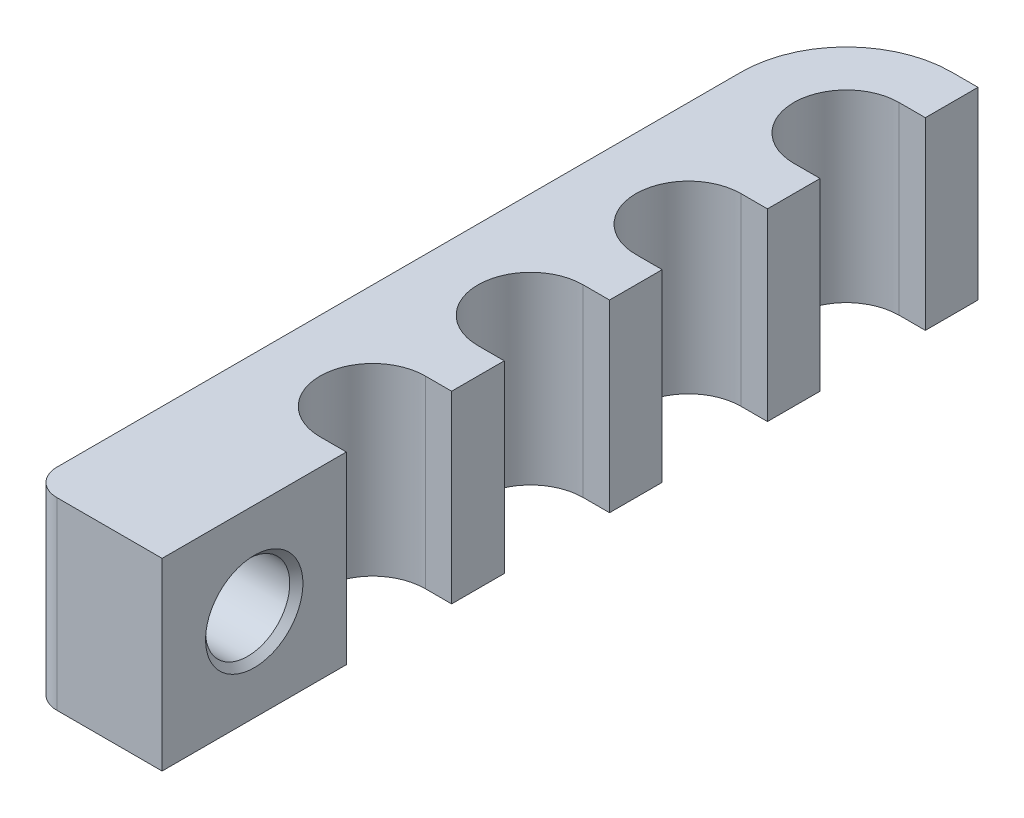
ISO-10303-21;
HEADER;
FILE_DESCRIPTION(('STEP AP214'),'2;1');
FILE_NAME('part.step','',(''),(''),'','','');
FILE_SCHEMA(('AUTOMOTIVE_DESIGN { 1 0 10303 214 1 1 1 1 }'));
ENDSEC;
DATA;
#1=APPLICATION_CONTEXT('core data for automotive mechanical design processes');
#2=APPLICATION_PROTOCOL_DEFINITION('international standard','automotive_design',2000,#1);
#3=PRODUCT_CONTEXT('',#1,'mechanical');
#4=PRODUCT('Part','Part','',(#3));
#5=PRODUCT_RELATED_PRODUCT_CATEGORY('part','',(#4));
#6=PRODUCT_DEFINITION_FORMATION('','',#4);
#7=PRODUCT_DEFINITION_CONTEXT('part definition',#1,'design');
#8=PRODUCT_DEFINITION('design','',#6,#7);
#9=PRODUCT_DEFINITION_SHAPE('','',#8);
#10=(LENGTH_UNIT() NAMED_UNIT(*) SI_UNIT(.MILLI.,.METRE.));
#11=(NAMED_UNIT(*) PLANE_ANGLE_UNIT() SI_UNIT($,.RADIAN.));
#12=(NAMED_UNIT(*) SI_UNIT($,.STERADIAN.) SOLID_ANGLE_UNIT());
#13=UNCERTAINTY_MEASURE_WITH_UNIT(LENGTH_MEASURE(1.E-05),#10,'distance_accuracy_value','');
#14=(GEOMETRIC_REPRESENTATION_CONTEXT(3) GLOBAL_UNCERTAINTY_ASSIGNED_CONTEXT((#13)) GLOBAL_UNIT_ASSIGNED_CONTEXT((#10,
#11,#12)) REPRESENTATION_CONTEXT('',''));
#15=CARTESIAN_POINT('',(0.,0.,0.));
#16=DIRECTION('',(0.,0.,1.));
#17=DIRECTION('',(1.,0.,0.));
#18=AXIS2_PLACEMENT_3D('',#15,#16,#17);
#19=CARTESIAN_POINT('',(-4.99999999999999,7.,0.));
#20=DIRECTION('',(1.,0.,0.));
#21=DIRECTION('',(0.,0.,-1.));
#22=AXIS2_PLACEMENT_3D('',#19,#20,#21);
#23=PLANE('',#22);
#24=CARTESIAN_POINT('',(-5.,3.5,-3.5));
#25=DIRECTION('',(1.,0.,0.));
#26=DIRECTION('',(0.,0.,-1.));
#27=AXIS2_PLACEMENT_3D('',#24,#25,#26);
#28=CIRCLE('',#27,1.84999999999998);
#29=CARTESIAN_POINT('',(-5.,3.5,-5.34999999999998));
#30=VERTEX_POINT('',#29);
#31=EDGE_CURVE('E223',#30,#30,#28,.T.);
#32=ORIENTED_EDGE('',*,*,#31,.T.);
#33=EDGE_LOOP('',(#32));
#34=FACE_BOUND('',#33,.T.);
#35=DIRECTION('',(0.,0.,1.));
#36=VECTOR('',#35,1.);
#37=CARTESIAN_POINT('',(-4.99999999999999,0.,0.));
#38=LINE('',#37,#36);
#39=CARTESIAN_POINT('',(-5.,0.,-27.));
#40=VERTEX_POINT('',#39);
#41=CARTESIAN_POINT('',(-4.99999999999999,0.,-0.999999999999999));
#42=VERTEX_POINT('',#41);
#43=EDGE_CURVE('E238',#40,#42,#38,.T.);
#44=ORIENTED_EDGE('',*,*,#43,.T.);
#45=DIRECTION('',(0.,-1.,0.));
#46=VECTOR('',#45,1.);
#47=CARTESIAN_POINT('',(-4.99999999999999,7.,-0.999999999999999));
#48=LINE('',#47,#46);
#49=CARTESIAN_POINT('',(-4.99999999999999,7.,-1.));
#50=VERTEX_POINT('',#49);
#51=EDGE_CURVE('E47',#42,#50,#48,.F.);
#52=ORIENTED_EDGE('',*,*,#51,.T.);
#53=DIRECTION('',(0.,0.,1.));
#54=VECTOR('',#53,1.);
#55=CARTESIAN_POINT('',(-5.,7.,-27.));
#56=LINE('',#55,#54);
#57=CARTESIAN_POINT('',(-5.,7.,-27.));
#58=VERTEX_POINT('',#57);
#59=EDGE_CURVE('E347',#58,#50,#56,.T.);
#60=ORIENTED_EDGE('',*,*,#59,.F.);
#61=DIRECTION('',(0.,-1.,0.));
#62=VECTOR('',#61,1.);
#63=CARTESIAN_POINT('',(-5.,7.,-27.));
#64=LINE('',#63,#62);
#65=EDGE_CURVE('E246',#58,#40,#64,.T.);
#66=ORIENTED_EDGE('',*,*,#65,.T.);
#67=EDGE_LOOP('',(#44,#52,#60,#66));
#68=FACE_BOUND('',#67,.T.);
#69=ADVANCED_FACE('F39',(#34,#68),#23,.F.);
#70=CARTESIAN_POINT('',(0.,7.,0.));
#71=DIRECTION('',(-1.,0.,0.));
#72=DIRECTION('',(0.,0.,1.));
#73=AXIS2_PLACEMENT_3D('',#70,#71,#72);
#74=PLANE('',#73);
#75=CARTESIAN_POINT('',(0.,3.5,-3.5));
#76=DIRECTION('',(-1.,0.,0.));
#77=DIRECTION('',(0.,0.,1.));
#78=AXIS2_PLACEMENT_3D('',#75,#76,#77);
#79=CIRCLE('',#78,1.85);
#80=CARTESIAN_POINT('',(0.,3.5,-1.65000000000001));
#81=VERTEX_POINT('',#80);
#82=EDGE_CURVE('E226',#81,#81,#79,.T.);
#83=ORIENTED_EDGE('',*,*,#82,.T.);
#84=EDGE_LOOP('',(#83));
#85=FACE_BOUND('',#84,.T.);
#86=DIRECTION('',(0.,0.,-1.));
#87=VECTOR('',#86,1.);
#88=CARTESIAN_POINT('',(0.,0.,0.));
#89=LINE('',#88,#87);
#90=CARTESIAN_POINT('',(0.,0.,0.));
#91=VERTEX_POINT('',#90);
#92=CARTESIAN_POINT('',(0.,0.,-7.));
#93=VERTEX_POINT('',#92);
#94=EDGE_CURVE('E211',#91,#93,#89,.T.);
#95=ORIENTED_EDGE('',*,*,#94,.T.);
#96=DIRECTION('',(0.,-1.,0.));
#97=VECTOR('',#96,1.);
#98=CARTESIAN_POINT('',(0.,7.,-7.));
#99=LINE('',#98,#97);
#100=CARTESIAN_POINT('',(0.,7.,-7.));
#101=VERTEX_POINT('',#100);
#102=EDGE_CURVE('E191',#101,#93,#99,.T.);
#103=ORIENTED_EDGE('',*,*,#102,.F.);
#104=DIRECTION('',(0.,0.,-1.));
#105=VECTOR('',#104,1.);
#106=CARTESIAN_POINT('',(0.,7.,0.));
#107=LINE('',#106,#105);
#108=CARTESIAN_POINT('',(0.,7.,0.));
#109=VERTEX_POINT('',#108);
#110=EDGE_CURVE('E198',#109,#101,#107,.T.);
#111=ORIENTED_EDGE('',*,*,#110,.F.);
#112=DIRECTION('',(0.,-1.,0.));
#113=VECTOR('',#112,1.);
#114=CARTESIAN_POINT('',(0.,7.,0.));
#115=LINE('',#114,#113);
#116=EDGE_CURVE('E244',#109,#91,#115,.T.);
#117=ORIENTED_EDGE('',*,*,#116,.T.);
#118=EDGE_LOOP('',(#95,#103,#111,#117));
#119=FACE_BOUND('',#118,.T.);
#120=ADVANCED_FACE('F209',(#85,#119),#74,.F.);
#121=CARTESIAN_POINT('',(-0.999999999999999,7.,-7.));
#122=DIRECTION('',(0.,0.,1.));
#123=DIRECTION('',(1.,0.,0.));
#124=AXIS2_PLACEMENT_3D('',#121,#122,#123);
#125=PLANE('',#124);
#126=DIRECTION('',(-1.,0.,0.));
#127=VECTOR('',#126,1.);
#128=CARTESIAN_POINT('',(-0.999999999999999,0.,-7.));
#129=LINE('',#128,#127);
#130=CARTESIAN_POINT('',(-0.999999999999999,0.,-7.));
#131=VERTEX_POINT('',#130);
#132=EDGE_CURVE('E311',#93,#131,#129,.T.);
#133=ORIENTED_EDGE('',*,*,#132,.T.);
#134=DIRECTION('',(0.,-1.,0.));
#135=VECTOR('',#134,1.);
#136=CARTESIAN_POINT('',(-0.999999999999999,7.,-7.));
#137=LINE('',#136,#135);
#138=CARTESIAN_POINT('',(-0.999999999999999,7.,-7.));
#139=VERTEX_POINT('',#138);
#140=EDGE_CURVE('E194',#139,#131,#137,.T.);
#141=ORIENTED_EDGE('',*,*,#140,.F.);
#142=DIRECTION('',(-1.,0.,0.));
#143=VECTOR('',#142,1.);
#144=CARTESIAN_POINT('',(-0.999999999999999,7.,-7.));
#145=LINE('',#144,#143);
#146=EDGE_CURVE('E187',#101,#139,#145,.T.);
#147=ORIENTED_EDGE('',*,*,#146,.F.);
#148=ORIENTED_EDGE('',*,*,#102,.T.);
#149=EDGE_LOOP('',(#133,#141,#147,#148));
#150=FACE_BOUND('',#149,.T.);
#151=ADVANCED_FACE('F189',(#150),#125,.F.);
#152=CARTESIAN_POINT('',(-0.999999999999999,7.,-9.));
#153=DIRECTION('',(0.,-1.,0.));
#154=DIRECTION('',(0.,0.,-1.));
#155=AXIS2_PLACEMENT_3D('',#152,#153,#154);
#156=CYLINDRICAL_SURFACE('',#155,2.);
#157=CARTESIAN_POINT('',(-0.999999999999999,0.,-9.));
#158=DIRECTION('',(0.,-1.,0.));
#159=DIRECTION('',(0.,0.,1.));
#160=AXIS2_PLACEMENT_3D('',#157,#158,#159);
#161=CIRCLE('',#160,2.);
#162=CARTESIAN_POINT('',(-0.999999999999999,0.,-11.));
#163=VERTEX_POINT('',#162);
#164=EDGE_CURVE('E305',#131,#163,#161,.T.);
#165=ORIENTED_EDGE('',*,*,#164,.T.);
#166=DIRECTION('',(0.,-1.,0.));
#167=VECTOR('',#166,1.);
#168=CARTESIAN_POINT('',(-0.999999999999999,7.,-11.));
#169=LINE('',#168,#167);
#170=CARTESIAN_POINT('',(-0.999999999999999,7.,-11.));
#171=VERTEX_POINT('',#170);
#172=EDGE_CURVE('E217',#171,#163,#169,.T.);
#173=ORIENTED_EDGE('',*,*,#172,.F.);
#174=CARTESIAN_POINT('',(-0.999999999999999,7.,-9.));
#175=DIRECTION('',(0.,-1.,0.));
#176=DIRECTION('',(0.,0.,1.));
#177=AXIS2_PLACEMENT_3D('',#174,#175,#176);
#178=CIRCLE('',#177,2.);
#179=EDGE_CURVE('E197',#139,#171,#178,.T.);
#180=ORIENTED_EDGE('',*,*,#179,.F.);
#181=ORIENTED_EDGE('',*,*,#140,.T.);
#182=EDGE_LOOP('',(#165,#173,#180,#181));
#183=FACE_BOUND('',#182,.T.);
#184=ADVANCED_FACE('F355',(#183),#156,.F.);
#185=CARTESIAN_POINT('',(0.,7.,-11.));
#186=DIRECTION('',(0.,0.,-1.));
#187=DIRECTION('',(-1.,0.,0.));
#188=AXIS2_PLACEMENT_3D('',#185,#186,#187);
#189=PLANE('',#188);
#190=DIRECTION('',(1.,0.,0.));
#191=VECTOR('',#190,1.);
#192=CARTESIAN_POINT('',(0.,0.,-11.));
#193=LINE('',#192,#191);
#194=CARTESIAN_POINT('',(0.,0.,-11.));
#195=VERTEX_POINT('',#194);
#196=EDGE_CURVE('E300',#163,#195,#193,.T.);
#197=ORIENTED_EDGE('',*,*,#196,.T.);
#198=DIRECTION('',(0.,-1.,0.));
#199=VECTOR('',#198,1.);
#200=CARTESIAN_POINT('',(0.,7.,-11.));
#201=LINE('',#200,#199);
#202=CARTESIAN_POINT('',(0.,7.,-11.));
#203=VERTEX_POINT('',#202);
#204=EDGE_CURVE('E291',#203,#195,#201,.T.);
#205=ORIENTED_EDGE('',*,*,#204,.F.);
#206=DIRECTION('',(1.,0.,0.));
#207=VECTOR('',#206,1.);
#208=CARTESIAN_POINT('',(0.,7.,-11.));
#209=LINE('',#208,#207);
#210=EDGE_CURVE('E301',#171,#203,#209,.T.);
#211=ORIENTED_EDGE('',*,*,#210,.F.);
#212=ORIENTED_EDGE('',*,*,#172,.T.);
#213=EDGE_LOOP('',(#197,#205,#211,#212));
#214=FACE_BOUND('',#213,.T.);
#215=ADVANCED_FACE('F298',(#214),#189,.F.);
#216=CARTESIAN_POINT('',(0.,7.,-13.));
#217=DIRECTION('',(-1.,0.,0.));
#218=DIRECTION('',(0.,0.,1.));
#219=AXIS2_PLACEMENT_3D('',#216,#217,#218);
#220=PLANE('',#219);
#221=DIRECTION('',(0.,0.,-1.));
#222=VECTOR('',#221,1.);
#223=CARTESIAN_POINT('',(0.,0.,-13.));
#224=LINE('',#223,#222);
#225=CARTESIAN_POINT('',(0.,0.,-13.));
#226=VERTEX_POINT('',#225);
#227=EDGE_CURVE('E307',#195,#226,#224,.T.);
#228=ORIENTED_EDGE('',*,*,#227,.T.);
#229=DIRECTION('',(0.,-1.,0.));
#230=VECTOR('',#229,1.);
#231=CARTESIAN_POINT('',(0.,7.,-13.));
#232=LINE('',#231,#230);
#233=CARTESIAN_POINT('',(0.,7.,-13.));
#234=VERTEX_POINT('',#233);
#235=EDGE_CURVE('E288',#234,#226,#232,.T.);
#236=ORIENTED_EDGE('',*,*,#235,.F.);
#237=DIRECTION('',(0.,0.,-1.));
#238=VECTOR('',#237,1.);
#239=CARTESIAN_POINT('',(0.,7.,-13.));
#240=LINE('',#239,#238);
#241=EDGE_CURVE('E357',#203,#234,#240,.T.);
#242=ORIENTED_EDGE('',*,*,#241,.F.);
#243=ORIENTED_EDGE('',*,*,#204,.T.);
#244=EDGE_LOOP('',(#228,#236,#242,#243));
#245=FACE_BOUND('',#244,.T.);
#246=ADVANCED_FACE('F449',(#245),#220,.F.);
#247=CARTESIAN_POINT('',(0.,7.,-13.));
#248=DIRECTION('',(0.,0.,1.));
#249=DIRECTION('',(1.,0.,0.));
#250=AXIS2_PLACEMENT_3D('',#247,#248,#249);
#251=PLANE('',#250);
#252=DIRECTION('',(-1.,0.,0.));
#253=VECTOR('',#252,1.);
#254=CARTESIAN_POINT('',(0.,0.,-13.));
#255=LINE('',#254,#253);
#256=CARTESIAN_POINT('',(-1.,0.,-13.));
#257=VERTEX_POINT('',#256);
#258=EDGE_CURVE('E309',#226,#257,#255,.T.);
#259=ORIENTED_EDGE('',*,*,#258,.T.);
#260=DIRECTION('',(0.,-1.,0.));
#261=VECTOR('',#260,1.);
#262=CARTESIAN_POINT('',(-1.,7.,-13.));
#263=LINE('',#262,#261);
#264=CARTESIAN_POINT('',(-1.,7.,-13.));
#265=VERTEX_POINT('',#264);
#266=EDGE_CURVE('E285',#265,#257,#263,.T.);
#267=ORIENTED_EDGE('',*,*,#266,.F.);
#268=DIRECTION('',(-1.,0.,0.));
#269=VECTOR('',#268,1.);
#270=CARTESIAN_POINT('',(0.,7.,-13.));
#271=LINE('',#270,#269);
#272=EDGE_CURVE('E361',#234,#265,#271,.T.);
#273=ORIENTED_EDGE('',*,*,#272,.F.);
#274=ORIENTED_EDGE('',*,*,#235,.T.);
#275=EDGE_LOOP('',(#259,#267,#273,#274));
#276=FACE_BOUND('',#275,.T.);
#277=ADVANCED_FACE('F445',(#276),#251,.F.);
#278=CARTESIAN_POINT('',(-1.,7.,-15.));
#279=DIRECTION('',(0.,-1.,0.));
#280=DIRECTION('',(0.,0.,-1.));
#281=AXIS2_PLACEMENT_3D('',#278,#279,#280);
#282=CYLINDRICAL_SURFACE('',#281,2.);
#283=CARTESIAN_POINT('',(-1.,0.,-15.));
#284=DIRECTION('',(0.,-1.,0.));
#285=DIRECTION('',(0.,0.,-1.));
#286=AXIS2_PLACEMENT_3D('',#283,#284,#285);
#287=CIRCLE('',#286,2.);
#288=CARTESIAN_POINT('',(-1.,0.,-17.));
#289=VERTEX_POINT('',#288);
#290=EDGE_CURVE('E316',#257,#289,#287,.T.);
#291=ORIENTED_EDGE('',*,*,#290,.T.);
#292=DIRECTION('',(0.,-1.,0.));
#293=VECTOR('',#292,1.);
#294=CARTESIAN_POINT('',(-1.,7.,-17.));
#295=LINE('',#294,#293);
#296=CARTESIAN_POINT('',(-1.,7.,-17.));
#297=VERTEX_POINT('',#296);
#298=EDGE_CURVE('E282',#297,#289,#295,.T.);
#299=ORIENTED_EDGE('',*,*,#298,.F.);
#300=CARTESIAN_POINT('',(-1.,7.,-15.));
#301=DIRECTION('',(0.,-1.,0.));
#302=DIRECTION('',(0.,0.,-1.));
#303=AXIS2_PLACEMENT_3D('',#300,#301,#302);
#304=CIRCLE('',#303,2.);
#305=EDGE_CURVE('E363',#265,#297,#304,.T.);
#306=ORIENTED_EDGE('',*,*,#305,.F.);
#307=ORIENTED_EDGE('',*,*,#266,.T.);
#308=EDGE_LOOP('',(#291,#299,#306,#307));
#309=FACE_BOUND('',#308,.T.);
#310=ADVANCED_FACE('F441',(#309),#282,.F.);
#311=CARTESIAN_POINT('',(-1.,7.,-17.));
#312=DIRECTION('',(0.,0.,-1.));
#313=DIRECTION('',(-1.,0.,0.));
#314=AXIS2_PLACEMENT_3D('',#311,#312,#313);
#315=PLANE('',#314);
#316=DIRECTION('',(1.,0.,0.));
#317=VECTOR('',#316,1.);
#318=CARTESIAN_POINT('',(-1.,0.,-17.));
#319=LINE('',#318,#317);
#320=CARTESIAN_POINT('',(0.,0.,-17.));
#321=VERTEX_POINT('',#320);
#322=EDGE_CURVE('E318',#289,#321,#319,.T.);
#323=ORIENTED_EDGE('',*,*,#322,.T.);
#324=DIRECTION('',(0.,-1.,0.));
#325=VECTOR('',#324,1.);
#326=CARTESIAN_POINT('',(0.,7.,-17.));
#327=LINE('',#326,#325);
#328=CARTESIAN_POINT('',(0.,7.,-17.));
#329=VERTEX_POINT('',#328);
#330=EDGE_CURVE('E279',#329,#321,#327,.T.);
#331=ORIENTED_EDGE('',*,*,#330,.F.);
#332=DIRECTION('',(1.,0.,0.));
#333=VECTOR('',#332,1.);
#334=CARTESIAN_POINT('',(-1.,7.,-17.));
#335=LINE('',#334,#333);
#336=EDGE_CURVE('E365',#297,#329,#335,.T.);
#337=ORIENTED_EDGE('',*,*,#336,.F.);
#338=ORIENTED_EDGE('',*,*,#298,.T.);
#339=EDGE_LOOP('',(#323,#331,#337,#338));
#340=FACE_BOUND('',#339,.T.);
#341=ADVANCED_FACE('F436',(#340),#315,.F.);
#342=CARTESIAN_POINT('',(0.,7.,-17.));
#343=DIRECTION('',(-1.,0.,0.));
#344=DIRECTION('',(0.,0.,1.));
#345=AXIS2_PLACEMENT_3D('',#342,#343,#344);
#346=PLANE('',#345);
#347=DIRECTION('',(0.,0.,-1.));
#348=VECTOR('',#347,1.);
#349=CARTESIAN_POINT('',(0.,0.,-17.));
#350=LINE('',#349,#348);
#351=CARTESIAN_POINT('',(0.,0.,-19.));
#352=VERTEX_POINT('',#351);
#353=EDGE_CURVE('E320',#321,#352,#350,.T.);
#354=ORIENTED_EDGE('',*,*,#353,.T.);
#355=DIRECTION('',(0.,-1.,0.));
#356=VECTOR('',#355,1.);
#357=CARTESIAN_POINT('',(0.,7.,-19.));
#358=LINE('',#357,#356);
#359=CARTESIAN_POINT('',(0.,7.,-19.));
#360=VERTEX_POINT('',#359);
#361=EDGE_CURVE('E276',#360,#352,#358,.T.);
#362=ORIENTED_EDGE('',*,*,#361,.F.);
#363=DIRECTION('',(0.,0.,-1.));
#364=VECTOR('',#363,1.);
#365=CARTESIAN_POINT('',(0.,7.,-17.));
#366=LINE('',#365,#364);
#367=EDGE_CURVE('E367',#329,#360,#366,.T.);
#368=ORIENTED_EDGE('',*,*,#367,.F.);
#369=ORIENTED_EDGE('',*,*,#330,.T.);
#370=EDGE_LOOP('',(#354,#362,#368,#369));
#371=FACE_BOUND('',#370,.T.);
#372=ADVANCED_FACE('F431',(#371),#346,.F.);
#373=CARTESIAN_POINT('',(0.,7.,-19.));
#374=DIRECTION('',(0.,0.,1.));
#375=DIRECTION('',(1.,0.,0.));
#376=AXIS2_PLACEMENT_3D('',#373,#374,#375);
#377=PLANE('',#376);
#378=DIRECTION('',(-1.,0.,0.));
#379=VECTOR('',#378,1.);
#380=CARTESIAN_POINT('',(0.,0.,-19.));
#381=LINE('',#380,#379);
#382=CARTESIAN_POINT('',(-1.,0.,-19.));
#383=VERTEX_POINT('',#382);
#384=EDGE_CURVE('E322',#352,#383,#381,.T.);
#385=ORIENTED_EDGE('',*,*,#384,.T.);
#386=DIRECTION('',(0.,-1.,0.));
#387=VECTOR('',#386,1.);
#388=CARTESIAN_POINT('',(-1.,7.,-19.));
#389=LINE('',#388,#387);
#390=CARTESIAN_POINT('',(-1.,7.,-19.));
#391=VERTEX_POINT('',#390);
#392=EDGE_CURVE('E273',#391,#383,#389,.T.);
#393=ORIENTED_EDGE('',*,*,#392,.F.);
#394=DIRECTION('',(-1.,0.,0.));
#395=VECTOR('',#394,1.);
#396=CARTESIAN_POINT('',(0.,7.,-19.));
#397=LINE('',#396,#395);
#398=EDGE_CURVE('E369',#360,#391,#397,.T.);
#399=ORIENTED_EDGE('',*,*,#398,.F.);
#400=ORIENTED_EDGE('',*,*,#361,.T.);
#401=EDGE_LOOP('',(#385,#393,#399,#400));
#402=FACE_BOUND('',#401,.T.);
#403=ADVANCED_FACE('F427',(#402),#377,.F.);
#404=CARTESIAN_POINT('',(-1.,7.,-21.));
#405=DIRECTION('',(0.,-1.,0.));
#406=DIRECTION('',(0.,0.,-1.));
#407=AXIS2_PLACEMENT_3D('',#404,#405,#406);
#408=CYLINDRICAL_SURFACE('',#407,1.99999999999999);
#409=CARTESIAN_POINT('',(-1.,0.,-21.));
#410=DIRECTION('',(0.,-1.,0.));
#411=DIRECTION('',(0.,0.,-1.));
#412=AXIS2_PLACEMENT_3D('',#409,#410,#411);
#413=CIRCLE('',#412,1.99999999999999);
#414=CARTESIAN_POINT('',(-1.,0.,-23.));
#415=VERTEX_POINT('',#414);
#416=EDGE_CURVE('E324',#383,#415,#413,.T.);
#417=ORIENTED_EDGE('',*,*,#416,.T.);
#418=DIRECTION('',(0.,-1.,0.));
#419=VECTOR('',#418,1.);
#420=CARTESIAN_POINT('',(-1.,7.,-23.));
#421=LINE('',#420,#419);
#422=CARTESIAN_POINT('',(-1.,7.,-23.));
#423=VERTEX_POINT('',#422);
#424=EDGE_CURVE('E270',#423,#415,#421,.T.);
#425=ORIENTED_EDGE('',*,*,#424,.F.);
#426=CARTESIAN_POINT('',(-1.,7.,-21.));
#427=DIRECTION('',(0.,-1.,0.));
#428=DIRECTION('',(0.,0.,-1.));
#429=AXIS2_PLACEMENT_3D('',#426,#427,#428);
#430=CIRCLE('',#429,1.99999999999999);
#431=EDGE_CURVE('E371',#391,#423,#430,.T.);
#432=ORIENTED_EDGE('',*,*,#431,.F.);
#433=ORIENTED_EDGE('',*,*,#392,.T.);
#434=EDGE_LOOP('',(#417,#425,#432,#433));
#435=FACE_BOUND('',#434,.T.);
#436=ADVANCED_FACE('F422',(#435),#408,.F.);
#437=CARTESIAN_POINT('',(-1.,7.,-23.));
#438=DIRECTION('',(0.,0.,-1.));
#439=DIRECTION('',(-1.,0.,0.));
#440=AXIS2_PLACEMENT_3D('',#437,#438,#439);
#441=PLANE('',#440);
#442=DIRECTION('',(1.,0.,0.));
#443=VECTOR('',#442,1.);
#444=CARTESIAN_POINT('',(-1.,0.,-23.));
#445=LINE('',#444,#443);
#446=CARTESIAN_POINT('',(0.,0.,-23.));
#447=VERTEX_POINT('',#446);
#448=EDGE_CURVE('E326',#415,#447,#445,.T.);
#449=ORIENTED_EDGE('',*,*,#448,.T.);
#450=DIRECTION('',(0.,-1.,0.));
#451=VECTOR('',#450,1.);
#452=CARTESIAN_POINT('',(0.,7.,-23.));
#453=LINE('',#452,#451);
#454=CARTESIAN_POINT('',(0.,7.,-23.));
#455=VERTEX_POINT('',#454);
#456=EDGE_CURVE('E267',#455,#447,#453,.T.);
#457=ORIENTED_EDGE('',*,*,#456,.F.);
#458=DIRECTION('',(1.,0.,0.));
#459=VECTOR('',#458,1.);
#460=CARTESIAN_POINT('',(-1.,7.,-23.));
#461=LINE('',#460,#459);
#462=EDGE_CURVE('E373',#423,#455,#461,.T.);
#463=ORIENTED_EDGE('',*,*,#462,.F.);
#464=ORIENTED_EDGE('',*,*,#424,.T.);
#465=EDGE_LOOP('',(#449,#457,#463,#464));
#466=FACE_BOUND('',#465,.T.);
#467=ADVANCED_FACE('F416',(#466),#441,.F.);
#468=CARTESIAN_POINT('',(0.,7.,-23.));
#469=DIRECTION('',(-1.,0.,0.));
#470=DIRECTION('',(0.,0.,1.));
#471=AXIS2_PLACEMENT_3D('',#468,#469,#470);
#472=PLANE('',#471);
#473=DIRECTION('',(0.,0.,-1.));
#474=VECTOR('',#473,1.);
#475=CARTESIAN_POINT('',(0.,0.,-23.));
#476=LINE('',#475,#474);
#477=CARTESIAN_POINT('',(0.,0.,-25.));
#478=VERTEX_POINT('',#477);
#479=EDGE_CURVE('E328',#447,#478,#476,.T.);
#480=ORIENTED_EDGE('',*,*,#479,.T.);
#481=DIRECTION('',(0.,-1.,0.));
#482=VECTOR('',#481,1.);
#483=CARTESIAN_POINT('',(0.,7.,-25.));
#484=LINE('',#483,#482);
#485=CARTESIAN_POINT('',(0.,7.,-25.));
#486=VERTEX_POINT('',#485);
#487=EDGE_CURVE('E264',#486,#478,#484,.T.);
#488=ORIENTED_EDGE('',*,*,#487,.F.);
#489=DIRECTION('',(0.,0.,-1.));
#490=VECTOR('',#489,1.);
#491=CARTESIAN_POINT('',(0.,7.,-23.));
#492=LINE('',#491,#490);
#493=EDGE_CURVE('E375',#455,#486,#492,.T.);
#494=ORIENTED_EDGE('',*,*,#493,.F.);
#495=ORIENTED_EDGE('',*,*,#456,.T.);
#496=EDGE_LOOP('',(#480,#488,#494,#495));
#497=FACE_BOUND('',#496,.T.);
#498=ADVANCED_FACE('F412',(#497),#472,.F.);
#499=CARTESIAN_POINT('',(0.,7.,-25.));
#500=DIRECTION('',(0.,0.,1.));
#501=DIRECTION('',(1.,0.,0.));
#502=AXIS2_PLACEMENT_3D('',#499,#500,#501);
#503=PLANE('',#502);
#504=DIRECTION('',(-1.,0.,0.));
#505=VECTOR('',#504,1.);
#506=CARTESIAN_POINT('',(0.,0.,-25.));
#507=LINE('',#506,#505);
#508=CARTESIAN_POINT('',(-1.,0.,-25.));
#509=VERTEX_POINT('',#508);
#510=EDGE_CURVE('E330',#478,#509,#507,.T.);
#511=ORIENTED_EDGE('',*,*,#510,.T.);
#512=DIRECTION('',(0.,-1.,0.));
#513=VECTOR('',#512,1.);
#514=CARTESIAN_POINT('',(-1.,7.,-25.));
#515=LINE('',#514,#513);
#516=CARTESIAN_POINT('',(-1.,7.,-25.));
#517=VERTEX_POINT('',#516);
#518=EDGE_CURVE('E261',#517,#509,#515,.T.);
#519=ORIENTED_EDGE('',*,*,#518,.F.);
#520=DIRECTION('',(-1.,0.,0.));
#521=VECTOR('',#520,1.);
#522=CARTESIAN_POINT('',(0.,7.,-25.));
#523=LINE('',#522,#521);
#524=EDGE_CURVE('E377',#486,#517,#523,.T.);
#525=ORIENTED_EDGE('',*,*,#524,.F.);
#526=ORIENTED_EDGE('',*,*,#487,.T.);
#527=EDGE_LOOP('',(#511,#519,#525,#526));
#528=FACE_BOUND('',#527,.T.);
#529=ADVANCED_FACE('F407',(#528),#503,.F.);
#530=CARTESIAN_POINT('',(-1.,7.,-27.));
#531=DIRECTION('',(0.,-1.,0.));
#532=DIRECTION('',(0.,0.,-1.));
#533=AXIS2_PLACEMENT_3D('',#530,#531,#532);
#534=CYLINDRICAL_SURFACE('',#533,2.);
#535=CARTESIAN_POINT('',(-1.,0.,-27.));
#536=DIRECTION('',(0.,-1.,0.));
#537=DIRECTION('',(0.,0.,-1.));
#538=AXIS2_PLACEMENT_3D('',#535,#536,#537);
#539=CIRCLE('',#538,2.);
#540=CARTESIAN_POINT('',(-1.,0.,-29.));
#541=VERTEX_POINT('',#540);
#542=EDGE_CURVE('E332',#509,#541,#539,.T.);
#543=ORIENTED_EDGE('',*,*,#542,.T.);
#544=DIRECTION('',(0.,-1.,0.));
#545=VECTOR('',#544,1.);
#546=CARTESIAN_POINT('',(-1.,7.,-29.));
#547=LINE('',#546,#545);
#548=CARTESIAN_POINT('',(-1.,7.,-29.));
#549=VERTEX_POINT('',#548);
#550=EDGE_CURVE('E258',#549,#541,#547,.T.);
#551=ORIENTED_EDGE('',*,*,#550,.F.);
#552=CARTESIAN_POINT('',(-1.,7.,-27.));
#553=DIRECTION('',(0.,-1.,0.));
#554=DIRECTION('',(0.,0.,-1.));
#555=AXIS2_PLACEMENT_3D('',#552,#553,#554);
#556=CIRCLE('',#555,2.);
#557=EDGE_CURVE('E379',#517,#549,#556,.T.);
#558=ORIENTED_EDGE('',*,*,#557,.F.);
#559=ORIENTED_EDGE('',*,*,#518,.T.);
#560=EDGE_LOOP('',(#543,#551,#558,#559));
#561=FACE_BOUND('',#560,.T.);
#562=ADVANCED_FACE('F401',(#561),#534,.F.);
#563=CARTESIAN_POINT('',(-1.,7.,-29.));
#564=DIRECTION('',(0.,0.,-1.));
#565=DIRECTION('',(-1.,0.,0.));
#566=AXIS2_PLACEMENT_3D('',#563,#564,#565);
#567=PLANE('',#566);
#568=DIRECTION('',(1.,0.,0.));
#569=VECTOR('',#568,1.);
#570=CARTESIAN_POINT('',(-1.,0.,-29.));
#571=LINE('',#570,#569);
#572=CARTESIAN_POINT('',(0.,0.,-29.));
#573=VERTEX_POINT('',#572);
#574=EDGE_CURVE('E334',#541,#573,#571,.T.);
#575=ORIENTED_EDGE('',*,*,#574,.T.);
#576=DIRECTION('',(0.,-1.,0.));
#577=VECTOR('',#576,1.);
#578=CARTESIAN_POINT('',(0.,7.,-29.));
#579=LINE('',#578,#577);
#580=CARTESIAN_POINT('',(0.,7.,-29.));
#581=VERTEX_POINT('',#580);
#582=EDGE_CURVE('E255',#581,#573,#579,.T.);
#583=ORIENTED_EDGE('',*,*,#582,.F.);
#584=DIRECTION('',(1.,0.,0.));
#585=VECTOR('',#584,1.);
#586=CARTESIAN_POINT('',(-1.,7.,-29.));
#587=LINE('',#586,#585);
#588=EDGE_CURVE('E381',#549,#581,#587,.T.);
#589=ORIENTED_EDGE('',*,*,#588,.F.);
#590=ORIENTED_EDGE('',*,*,#550,.T.);
#591=EDGE_LOOP('',(#575,#583,#589,#590));
#592=FACE_BOUND('',#591,.T.);
#593=ADVANCED_FACE('F397',(#592),#567,.F.);
#594=CARTESIAN_POINT('',(0.,7.,-29.));
#595=DIRECTION('',(-1.,0.,0.));
#596=DIRECTION('',(0.,0.,1.));
#597=AXIS2_PLACEMENT_3D('',#594,#595,#596);
#598=PLANE('',#597);
#599=DIRECTION('',(0.,0.,-1.));
#600=VECTOR('',#599,1.);
#601=CARTESIAN_POINT('',(0.,0.,-29.));
#602=LINE('',#601,#600);
#603=CARTESIAN_POINT('',(0.,0.,-31.));
#604=VERTEX_POINT('',#603);
#605=EDGE_CURVE('E336',#573,#604,#602,.T.);
#606=ORIENTED_EDGE('',*,*,#605,.T.);
#607=DIRECTION('',(0.,-1.,0.));
#608=VECTOR('',#607,1.);
#609=CARTESIAN_POINT('',(0.,7.,-31.));
#610=LINE('',#609,#608);
#611=CARTESIAN_POINT('',(0.,7.,-31.));
#612=VERTEX_POINT('',#611);
#613=EDGE_CURVE('E252',#612,#604,#610,.T.);
#614=ORIENTED_EDGE('',*,*,#613,.F.);
#615=DIRECTION('',(0.,0.,-1.));
#616=VECTOR('',#615,1.);
#617=CARTESIAN_POINT('',(0.,7.,-29.));
#618=LINE('',#617,#616);
#619=EDGE_CURVE('E383',#581,#612,#618,.T.);
#620=ORIENTED_EDGE('',*,*,#619,.F.);
#621=ORIENTED_EDGE('',*,*,#582,.T.);
#622=EDGE_LOOP('',(#606,#614,#620,#621));
#623=FACE_BOUND('',#622,.T.);
#624=ADVANCED_FACE('F393',(#623),#598,.F.);
#625=CARTESIAN_POINT('',(0.,7.,-31.));
#626=DIRECTION('',(0.,0.,1.));
#627=DIRECTION('',(1.,0.,0.));
#628=AXIS2_PLACEMENT_3D('',#625,#626,#627);
#629=PLANE('',#628);
#630=DIRECTION('',(-1.,0.,0.));
#631=VECTOR('',#630,1.);
#632=CARTESIAN_POINT('',(0.,0.,-31.));
#633=LINE('',#632,#631);
#634=CARTESIAN_POINT('',(-0.999999999999999,0.,-31.));
#635=VERTEX_POINT('',#634);
#636=EDGE_CURVE('E338',#604,#635,#633,.T.);
#637=ORIENTED_EDGE('',*,*,#636,.T.);
#638=DIRECTION('',(0.,-1.,0.));
#639=VECTOR('',#638,1.);
#640=CARTESIAN_POINT('',(-0.999999999999999,7.,-31.));
#641=LINE('',#640,#639);
#642=CARTESIAN_POINT('',(-0.999999999999999,7.,-31.));
#643=VERTEX_POINT('',#642);
#644=EDGE_CURVE('E249',#643,#635,#641,.T.);
#645=ORIENTED_EDGE('',*,*,#644,.F.);
#646=DIRECTION('',(-1.,0.,0.));
#647=VECTOR('',#646,1.);
#648=CARTESIAN_POINT('',(0.,7.,-31.));
#649=LINE('',#648,#647);
#650=EDGE_CURVE('E351',#612,#643,#649,.T.);
#651=ORIENTED_EDGE('',*,*,#650,.F.);
#652=ORIENTED_EDGE('',*,*,#613,.T.);
#653=EDGE_LOOP('',(#637,#645,#651,#652));
#654=FACE_BOUND('',#653,.T.);
#655=ADVANCED_FACE('F388',(#654),#629,.F.);
#656=CARTESIAN_POINT('',(-0.999999999999999,7.,-27.));
#657=DIRECTION('',(0.,-1.,0.));
#658=DIRECTION('',(0.,0.,-1.));
#659=AXIS2_PLACEMENT_3D('',#656,#657,#658);
#660=CYLINDRICAL_SURFACE('',#659,3.99999999999999);
#661=CARTESIAN_POINT('',(-0.999999999999999,0.,-27.));
#662=DIRECTION('',(0.,1.,0.));
#663=DIRECTION('',(0.,0.,1.));
#664=AXIS2_PLACEMENT_3D('',#661,#662,#663);
#665=CIRCLE('',#664,3.99999999999999);
#666=EDGE_CURVE('E240',#635,#40,#665,.T.);
#667=ORIENTED_EDGE('',*,*,#666,.T.);
#668=ORIENTED_EDGE('',*,*,#65,.F.);
#669=CARTESIAN_POINT('',(-0.999999999999999,7.,-27.));
#670=DIRECTION('',(0.,1.,0.));
#671=DIRECTION('',(0.,0.,1.));
#672=AXIS2_PLACEMENT_3D('',#669,#670,#671);
#673=CIRCLE('',#672,3.99999999999999);
#674=EDGE_CURVE('E348',#643,#58,#673,.T.);
#675=ORIENTED_EDGE('',*,*,#674,.F.);
#676=ORIENTED_EDGE('',*,*,#644,.T.);
#677=EDGE_LOOP('',(#667,#668,#675,#676));
#678=FACE_BOUND('',#677,.T.);
#679=ADVANCED_FACE('F343',(#678),#660,.T.);
#680=CARTESIAN_POINT('',(0.,7.,0.));
#681=DIRECTION('',(0.,0.,-1.));
#682=DIRECTION('',(-1.,0.,0.));
#683=AXIS2_PLACEMENT_3D('',#680,#681,#682);
#684=PLANE('',#683);
#685=DIRECTION('',(1.,0.,0.));
#686=VECTOR('',#685,1.);
#687=CARTESIAN_POINT('',(0.,7.,0.));
#688=LINE('',#687,#686);
#689=CARTESIAN_POINT('',(-3.99999999999999,7.,0.));
#690=VERTEX_POINT('',#689);
#691=EDGE_CURVE('E203',#690,#109,#688,.T.);
#692=ORIENTED_EDGE('',*,*,#691,.F.);
#693=DIRECTION('',(0.,-1.,0.));
#694=VECTOR('',#693,1.);
#695=CARTESIAN_POINT('',(-3.99999999999999,7.,0.));
#696=LINE('',#695,#694);
#697=CARTESIAN_POINT('',(-3.99999999999999,0.,0.));
#698=VERTEX_POINT('',#697);
#699=EDGE_CURVE('E229',#690,#698,#696,.T.);
#700=ORIENTED_EDGE('',*,*,#699,.T.);
#701=DIRECTION('',(1.,0.,0.));
#702=VECTOR('',#701,1.);
#703=CARTESIAN_POINT('',(0.,0.,0.));
#704=LINE('',#703,#702);
#705=EDGE_CURVE('E207',#698,#91,#704,.T.);
#706=ORIENTED_EDGE('',*,*,#705,.T.);
#707=ORIENTED_EDGE('',*,*,#116,.F.);
#708=EDGE_LOOP('',(#692,#700,#706,#707));
#709=FACE_BOUND('',#708,.T.);
#710=ADVANCED_FACE('F234',(#709),#684,.F.);
#711=CARTESIAN_POINT('',(-0.999999999999999,7.,-9.));
#712=DIRECTION('',(0.,1.,0.));
#713=DIRECTION('',(0.,0.,1.));
#714=AXIS2_PLACEMENT_3D('',#711,#712,#713);
#715=PLANE('',#714);
#716=ORIENTED_EDGE('',*,*,#59,.T.);
#717=CARTESIAN_POINT('',(-3.99999999999999,7.,-1.));
#718=DIRECTION('',(0.,1.,0.));
#719=DIRECTION('',(0.,0.,1.));
#720=AXIS2_PLACEMENT_3D('',#717,#718,#719);
#721=CIRCLE('',#720,1.);
#722=EDGE_CURVE('E11',#50,#690,#721,.T.);
#723=ORIENTED_EDGE('',*,*,#722,.T.);
#724=ORIENTED_EDGE('',*,*,#691,.T.);
#725=ORIENTED_EDGE('',*,*,#110,.T.);
#726=ORIENTED_EDGE('',*,*,#146,.T.);
#727=ORIENTED_EDGE('',*,*,#179,.T.);
#728=ORIENTED_EDGE('',*,*,#210,.T.);
#729=ORIENTED_EDGE('',*,*,#241,.T.);
#730=ORIENTED_EDGE('',*,*,#272,.T.);
#731=ORIENTED_EDGE('',*,*,#305,.T.);
#732=ORIENTED_EDGE('',*,*,#336,.T.);
#733=ORIENTED_EDGE('',*,*,#367,.T.);
#734=ORIENTED_EDGE('',*,*,#398,.T.);
#735=ORIENTED_EDGE('',*,*,#431,.T.);
#736=ORIENTED_EDGE('',*,*,#462,.T.);
#737=ORIENTED_EDGE('',*,*,#493,.T.);
#738=ORIENTED_EDGE('',*,*,#524,.T.);
#739=ORIENTED_EDGE('',*,*,#557,.T.);
#740=ORIENTED_EDGE('',*,*,#588,.T.);
#741=ORIENTED_EDGE('',*,*,#619,.T.);
#742=ORIENTED_EDGE('',*,*,#650,.T.);
#743=ORIENTED_EDGE('',*,*,#674,.T.);
#744=EDGE_LOOP('',(#716,#723,#724,#725,#726,#727,#728,#729,#730,#731,#732,#733,#734,#735,#736,
#737,#738,#739,#740,#741,#742,#743));
#745=FACE_BOUND('',#744,.T.);
#746=ADVANCED_FACE('F201',(#745),#715,.T.);
#747=CARTESIAN_POINT('',(-0.999999999999999,0.,-9.));
#748=DIRECTION('',(0.,1.,0.));
#749=DIRECTION('',(0.,0.,1.));
#750=AXIS2_PLACEMENT_3D('',#747,#748,#749);
#751=PLANE('',#750);
#752=ORIENTED_EDGE('',*,*,#705,.F.);
#753=CARTESIAN_POINT('',(-3.99999999999999,0.,-1.));
#754=DIRECTION('',(0.,1.,0.));
#755=DIRECTION('',(0.,0.,1.));
#756=AXIS2_PLACEMENT_3D('',#753,#754,#755);
#757=CIRCLE('',#756,1.);
#758=EDGE_CURVE('E61',#698,#42,#757,.F.);
#759=ORIENTED_EDGE('',*,*,#758,.T.);
#760=ORIENTED_EDGE('',*,*,#43,.F.);
#761=ORIENTED_EDGE('',*,*,#666,.F.);
#762=ORIENTED_EDGE('',*,*,#636,.F.);
#763=ORIENTED_EDGE('',*,*,#605,.F.);
#764=ORIENTED_EDGE('',*,*,#574,.F.);
#765=ORIENTED_EDGE('',*,*,#542,.F.);
#766=ORIENTED_EDGE('',*,*,#510,.F.);
#767=ORIENTED_EDGE('',*,*,#479,.F.);
#768=ORIENTED_EDGE('',*,*,#448,.F.);
#769=ORIENTED_EDGE('',*,*,#416,.F.);
#770=ORIENTED_EDGE('',*,*,#384,.F.);
#771=ORIENTED_EDGE('',*,*,#353,.F.);
#772=ORIENTED_EDGE('',*,*,#322,.F.);
#773=ORIENTED_EDGE('',*,*,#290,.F.);
#774=ORIENTED_EDGE('',*,*,#258,.F.);
#775=ORIENTED_EDGE('',*,*,#227,.F.);
#776=ORIENTED_EDGE('',*,*,#196,.F.);
#777=ORIENTED_EDGE('',*,*,#164,.F.);
#778=ORIENTED_EDGE('',*,*,#132,.F.);
#779=ORIENTED_EDGE('',*,*,#94,.F.);
#780=EDGE_LOOP('',(#752,#759,#760,#761,#762,#763,#764,#765,#766,#767,#768,#769,#770,#771,#772,
#773,#774,#775,#776,#777,#778,#779));
#781=FACE_BOUND('',#780,.T.);
#782=ADVANCED_FACE('F237',(#781),#751,.F.);
#783=CARTESIAN_POINT('',(-5.,3.5,-3.5));
#784=DIRECTION('',(-1.,0.,0.));
#785=DIRECTION('',(0.,0.,1.));
#786=AXIS2_PLACEMENT_3D('',#783,#784,#785);
#787=CYLINDRICAL_SURFACE('',#786,1.59999999999999);
#788=CARTESIAN_POINT('',(-4.75000000000001,3.5,-3.5));
#789=DIRECTION('',(1.,0.,0.));
#790=DIRECTION('',(0.,0.,-1.));
#791=AXIS2_PLACEMENT_3D('',#788,#789,#790);
#792=CIRCLE('',#791,1.59999999999999);
#793=CARTESIAN_POINT('',(-4.75000000000001,3.5,-5.09999999999999));
#794=VERTEX_POINT('',#793);
#795=EDGE_CURVE('E215',#794,#794,#792,.F.);
#796=ORIENTED_EDGE('',*,*,#795,.T.);
#797=EDGE_LOOP('',(#796));
#798=FACE_BOUND('',#797,.T.);
#799=CARTESIAN_POINT('',(-0.250000000000006,3.5,-3.5));
#800=DIRECTION('',(-1.,0.,0.));
#801=DIRECTION('',(0.,0.,1.));
#802=AXIS2_PLACEMENT_3D('',#799,#800,#801);
#803=CIRCLE('',#802,1.59999999999999);
#804=CARTESIAN_POINT('',(-0.250000000000004,3.5,-1.90000000000001));
#805=VERTEX_POINT('',#804);
#806=EDGE_CURVE('E212',#805,#805,#803,.F.);
#807=ORIENTED_EDGE('',*,*,#806,.T.);
#808=EDGE_LOOP('',(#807));
#809=FACE_BOUND('',#808,.T.);
#810=ADVANCED_FACE('F564',(#798,#809),#787,.F.);
#811=CARTESIAN_POINT('',(-4.75000000000001,3.5,-3.5));
#812=DIRECTION('',(-1.,0.,0.));
#813=DIRECTION('',(0.,0.,1.));
#814=AXIS2_PLACEMENT_3D('',#811,#812,#813);
#815=CONICAL_SURFACE('',#814,1.59999999999999,0.785398163397453);
#816=ORIENTED_EDGE('',*,*,#31,.F.);
#817=EDGE_LOOP('',(#816));
#818=FACE_BOUND('',#817,.T.);
#819=ORIENTED_EDGE('',*,*,#795,.F.);
#820=EDGE_LOOP('',(#819));
#821=FACE_BOUND('',#820,.T.);
#822=ADVANCED_FACE('F571',(#818,#821),#815,.F.);
#823=CARTESIAN_POINT('',(0.,3.5,-3.5));
#824=DIRECTION('',(1.,0.,0.));
#825=DIRECTION('',(0.,0.,-1.));
#826=AXIS2_PLACEMENT_3D('',#823,#824,#825);
#827=CONICAL_SURFACE('',#826,1.85,0.785398163397446);
#828=ORIENTED_EDGE('',*,*,#806,.F.);
#829=EDGE_LOOP('',(#828));
#830=FACE_BOUND('',#829,.T.);
#831=ORIENTED_EDGE('',*,*,#82,.F.);
#832=EDGE_LOOP('',(#831));
#833=FACE_BOUND('',#832,.T.);
#834=ADVANCED_FACE('F579',(#830,#833),#827,.F.);
#835=CARTESIAN_POINT('',(-3.99999999999999,7.,-1.));
#836=DIRECTION('',(0.,-1.,0.));
#837=DIRECTION('',(0.,0.,-1.));
#838=AXIS2_PLACEMENT_3D('',#835,#836,#837);
#839=CYLINDRICAL_SURFACE('',#838,1.);
#840=ORIENTED_EDGE('',*,*,#722,.F.);
#841=ORIENTED_EDGE('',*,*,#51,.F.);
#842=ORIENTED_EDGE('',*,*,#758,.F.);
#843=ORIENTED_EDGE('',*,*,#699,.F.);
#844=EDGE_LOOP('',(#840,#841,#842,#843));
#845=FACE_BOUND('',#844,.T.);
#846=ADVANCED_FACE('F41',(#845),#839,.T.);
#847=CLOSED_SHELL('',(#69,#120,#151,#184,#215,#246,#277,#310,#341,#372,#403,#436,#467,#498,#529,
#562,#593,#624,#655,#679,#710,#746,#782,#810,#822,#834,#846));
#848=MANIFOLD_SOLID_BREP('B2',#847);
#849=ADVANCED_BREP_SHAPE_REPRESENTATION('',(#18,#848),#14);
#850=SHAPE_DEFINITION_REPRESENTATION(#9,#849);
ENDSEC;
END-ISO-10303-21;
